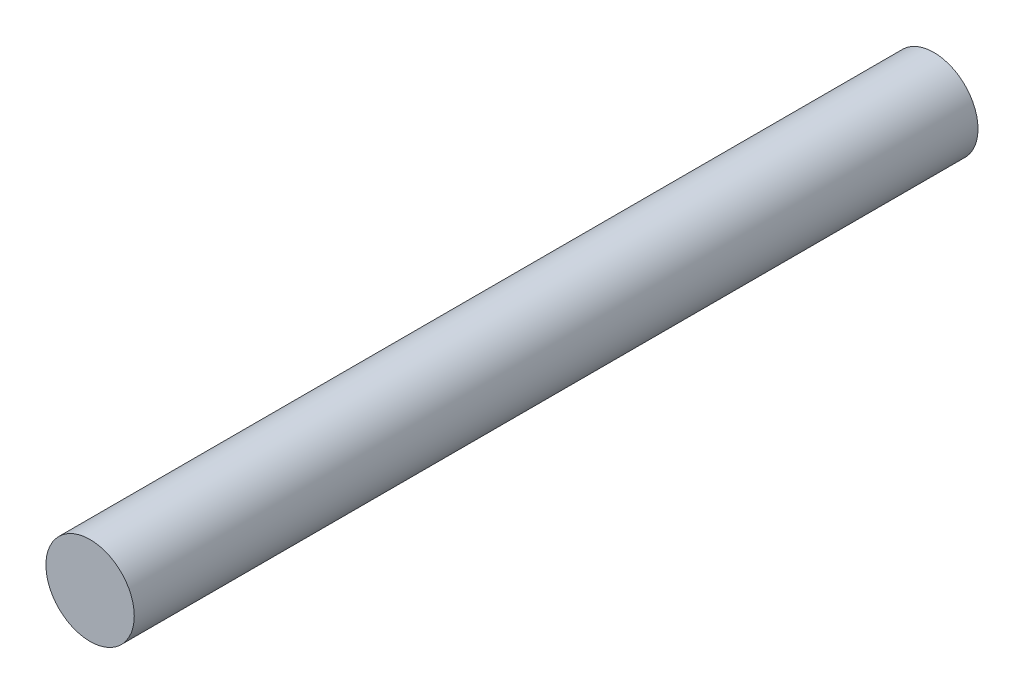
ISO-10303-21;
HEADER;
FILE_DESCRIPTION(('STEP AP214'),'2;1');
FILE_NAME('part.step','',(''),(''),'','','');
FILE_SCHEMA(('AUTOMOTIVE_DESIGN { 1 0 10303 214 1 1 1 1 }'));
ENDSEC;
DATA;
#1=APPLICATION_CONTEXT('core data for automotive mechanical design processes');
#2=APPLICATION_PROTOCOL_DEFINITION('international standard','automotive_design',2000,#1);
#3=PRODUCT_CONTEXT('',#1,'mechanical');
#4=PRODUCT('Part','Part','',(#3));
#5=PRODUCT_RELATED_PRODUCT_CATEGORY('part','',(#4));
#6=PRODUCT_DEFINITION_FORMATION('','',#4);
#7=PRODUCT_DEFINITION_CONTEXT('part definition',#1,'design');
#8=PRODUCT_DEFINITION('design','',#6,#7);
#9=PRODUCT_DEFINITION_SHAPE('','',#8);
#10=(LENGTH_UNIT() NAMED_UNIT(*) SI_UNIT(.MILLI.,.METRE.));
#11=(NAMED_UNIT(*) PLANE_ANGLE_UNIT() SI_UNIT($,.RADIAN.));
#12=(NAMED_UNIT(*) SI_UNIT($,.STERADIAN.) SOLID_ANGLE_UNIT());
#13=UNCERTAINTY_MEASURE_WITH_UNIT(LENGTH_MEASURE(1.E-05),#10,'distance_accuracy_value','');
#14=(GEOMETRIC_REPRESENTATION_CONTEXT(3) GLOBAL_UNCERTAINTY_ASSIGNED_CONTEXT((#13)) GLOBAL_UNIT_ASSIGNED_CONTEXT((#10,
#11,#12)) REPRESENTATION_CONTEXT('',''));
#15=CARTESIAN_POINT('',(0.,0.,0.));
#16=DIRECTION('',(0.,0.,1.));
#17=DIRECTION('',(1.,0.,0.));
#18=AXIS2_PLACEMENT_3D('',#15,#16,#17);
#19=CARTESIAN_POINT('',(0.,0.,-109.642135623731));
#20=DIRECTION('',(0.,0.,1.));
#21=DIRECTION('',(1.,0.,0.));
#22=AXIS2_PLACEMENT_3D('',#19,#20,#21);
#23=CYLINDRICAL_SURFACE('',#22,5.);
#24=CARTESIAN_POINT('',(0.,0.,-95.5));
#25=DIRECTION('',(0.,0.,1.));
#26=DIRECTION('',(1.,0.,0.));
#27=AXIS2_PLACEMENT_3D('',#24,#25,#26);
#28=CIRCLE('',#27,5.);
#29=CARTESIAN_POINT('',(5.,0.,-95.5));
#30=VERTEX_POINT('',#29);
#31=EDGE_CURVE('E10',#30,#30,#28,.F.);
#32=ORIENTED_EDGE('',*,*,#31,.F.);
#33=EDGE_LOOP('',(#32));
#34=FACE_BOUND('',#33,.T.);
#35=CARTESIAN_POINT('',(0.,0.,0.));
#36=DIRECTION('',(0.,0.,1.));
#37=DIRECTION('',(1.,0.,0.));
#38=AXIS2_PLACEMENT_3D('',#35,#36,#37);
#39=CIRCLE('',#38,5.);
#40=CARTESIAN_POINT('',(5.,0.,0.));
#41=VERTEX_POINT('',#40);
#42=EDGE_CURVE('E41',#41,#41,#39,.T.);
#43=ORIENTED_EDGE('',*,*,#42,.F.);
#44=EDGE_LOOP('',(#43));
#45=FACE_BOUND('',#44,.T.);
#46=ADVANCED_FACE('F35',(#34,#45),#23,.T.);
#47=CARTESIAN_POINT('',(0.,0.,0.));
#48=DIRECTION('',(0.,0.,1.));
#49=DIRECTION('',(1.,0.,0.));
#50=AXIS2_PLACEMENT_3D('',#47,#48,#49);
#51=PLANE('',#50);
#52=ORIENTED_EDGE('',*,*,#42,.T.);
#53=EDGE_LOOP('',(#52));
#54=FACE_BOUND('',#53,.T.);
#55=ADVANCED_FACE('F47',(#54),#51,.T.);
#56=CARTESIAN_POINT('',(0.,0.,-95.5));
#57=DIRECTION('',(0.,0.,1.));
#58=DIRECTION('',(0.,-1.,0.));
#59=AXIS2_PLACEMENT_3D('',#56,#57,#58);
#60=PLANE('',#59);
#61=ORIENTED_EDGE('',*,*,#31,.T.);
#62=EDGE_LOOP('',(#61));
#63=FACE_BOUND('',#62,.T.);
#64=ADVANCED_FACE('F54',(#63),#60,.F.);
#65=CLOSED_SHELL('',(#46,#55,#64));
#66=MANIFOLD_SOLID_BREP('B2',#65);
#67=ADVANCED_BREP_SHAPE_REPRESENTATION('',(#18,#66),#14);
#68=SHAPE_DEFINITION_REPRESENTATION(#9,#67);
ENDSEC;
END-ISO-10303-21;
